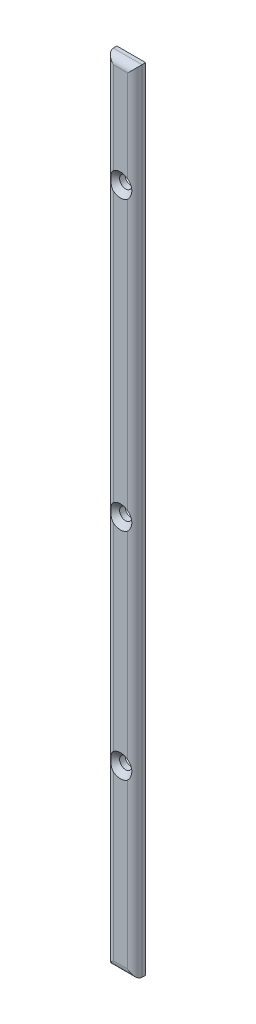
ISO-10303-21;
HEADER;
FILE_DESCRIPTION(('STEP AP214'),'2;1');
FILE_NAME('part.step','',(''),(''),'','','');
FILE_SCHEMA(('AUTOMOTIVE_DESIGN { 1 0 10303 214 1 1 1 1 }'));
ENDSEC;
DATA;
#1=APPLICATION_CONTEXT('core data for automotive mechanical design processes');
#2=APPLICATION_PROTOCOL_DEFINITION('international standard','automotive_design',2000,#1);
#3=PRODUCT_CONTEXT('',#1,'mechanical');
#4=PRODUCT('Part','Part','',(#3));
#5=PRODUCT_RELATED_PRODUCT_CATEGORY('part','',(#4));
#6=PRODUCT_DEFINITION_FORMATION('','',#4);
#7=PRODUCT_DEFINITION_CONTEXT('part definition',#1,'design');
#8=PRODUCT_DEFINITION('design','',#6,#7);
#9=PRODUCT_DEFINITION_SHAPE('','',#8);
#10=(LENGTH_UNIT() NAMED_UNIT(*) SI_UNIT(.MILLI.,.METRE.));
#11=(NAMED_UNIT(*) PLANE_ANGLE_UNIT() SI_UNIT($,.RADIAN.));
#12=(NAMED_UNIT(*) SI_UNIT($,.STERADIAN.) SOLID_ANGLE_UNIT());
#13=UNCERTAINTY_MEASURE_WITH_UNIT(LENGTH_MEASURE(1.E-05),#10,'distance_accuracy_value','');
#14=(GEOMETRIC_REPRESENTATION_CONTEXT(3) GLOBAL_UNCERTAINTY_ASSIGNED_CONTEXT((#13)) GLOBAL_UNIT_ASSIGNED_CONTEXT((#10,
#11,#12)) REPRESENTATION_CONTEXT('',''));
#15=CARTESIAN_POINT('',(0.,0.,0.));
#16=DIRECTION('',(0.,0.,1.));
#17=DIRECTION('',(1.,0.,0.));
#18=AXIS2_PLACEMENT_3D('',#15,#16,#17);
#19=CARTESIAN_POINT('',(0.,0.,3.));
#20=DIRECTION('',(0.,0.,1.));
#21=DIRECTION('',(1.,0.,0.));
#22=AXIS2_PLACEMENT_3D('',#19,#20,#21);
#23=PLANE('',#22);
#24=CARTESIAN_POINT('',(0.,80.,3.));
#25=DIRECTION('',(0.,0.,1.));
#26=DIRECTION('',(1.,0.,0.));
#27=AXIS2_PLACEMENT_3D('',#24,#25,#26);
#28=CIRCLE('',#27,3.15);
#29=CARTESIAN_POINT('',(-2.,77.5663812952724,3.));
#30=VERTEX_POINT('',#29);
#31=CARTESIAN_POINT('',(2.,77.5663812952724,3.));
#32=VERTEX_POINT('',#31);
#33=EDGE_CURVE('E164',#30,#32,#28,.T.);
#34=ORIENTED_EDGE('',*,*,#33,.F.);
#35=DIRECTION('',(0.,-1.,0.));
#36=VECTOR('',#35,1.);
#37=CARTESIAN_POINT('',(-2.,-110.,3.));
#38=LINE('',#37,#36);
#39=CARTESIAN_POINT('',(-2.,2.4336187047276,3.));
#40=VERTEX_POINT('',#39);
#41=EDGE_CURVE('E189',#30,#40,#38,.T.);
#42=ORIENTED_EDGE('',*,*,#41,.T.);
#43=CARTESIAN_POINT('',(0.,0.,3.));
#44=DIRECTION('',(0.,0.,1.));
#45=DIRECTION('',(1.,0.,0.));
#46=AXIS2_PLACEMENT_3D('',#43,#44,#45);
#47=CIRCLE('',#46,3.15);
#48=CARTESIAN_POINT('',(2.,2.4336187047276,3.));
#49=VERTEX_POINT('',#48);
#50=EDGE_CURVE('E336',#49,#40,#47,.T.);
#51=ORIENTED_EDGE('',*,*,#50,.F.);
#52=DIRECTION('',(0.,1.,0.));
#53=VECTOR('',#52,1.);
#54=CARTESIAN_POINT('',(2.,110.,3.));
#55=LINE('',#54,#53);
#56=EDGE_CURVE('E176',#49,#32,#55,.T.);
#57=ORIENTED_EDGE('',*,*,#56,.T.);
#58=EDGE_LOOP('',(#34,#42,#51,#57));
#59=FACE_BOUND('',#58,.T.);
#60=ADVANCED_FACE('F33',(#59),#23,.T.);
#61=CARTESIAN_POINT('',(-2.,-2.43361870472758,3.));
#62=VERTEX_POINT('',#61);
#63=CARTESIAN_POINT('',(2.,-2.43361870472759,3.));
#64=VERTEX_POINT('',#63);
#65=EDGE_CURVE('E169',#62,#64,#47,.T.);
#66=ORIENTED_EDGE('',*,*,#65,.F.);
#67=DIRECTION('',(0.,-1.,0.));
#68=VECTOR('',#67,1.);
#69=CARTESIAN_POINT('',(-2.,-110.,3.));
#70=LINE('',#69,#68);
#71=CARTESIAN_POINT('',(-2.,-57.5663812952724,3.));
#72=VERTEX_POINT('',#71);
#73=EDGE_CURVE('E187',#62,#72,#70,.T.);
#74=ORIENTED_EDGE('',*,*,#73,.T.);
#75=CARTESIAN_POINT('',(0.,-60.,3.));
#76=DIRECTION('',(0.,0.,1.));
#77=DIRECTION('',(1.,0.,0.));
#78=AXIS2_PLACEMENT_3D('',#75,#76,#77);
#79=CIRCLE('',#78,3.15);
#80=CARTESIAN_POINT('',(2.,-57.5663812952724,3.));
#81=VERTEX_POINT('',#80);
#82=EDGE_CURVE('E327',#81,#72,#79,.T.);
#83=ORIENTED_EDGE('',*,*,#82,.F.);
#84=DIRECTION('',(0.,1.,0.));
#85=VECTOR('',#84,1.);
#86=CARTESIAN_POINT('',(2.,110.,3.));
#87=LINE('',#86,#85);
#88=EDGE_CURVE('E178',#81,#64,#87,.T.);
#89=ORIENTED_EDGE('',*,*,#88,.T.);
#90=EDGE_LOOP('',(#66,#74,#83,#89));
#91=FACE_BOUND('',#90,.T.);
#92=ADVANCED_FACE('F250',(#91),#23,.T.);
#93=CARTESIAN_POINT('',(-2.,-62.4336187047276,3.));
#94=VERTEX_POINT('',#93);
#95=CARTESIAN_POINT('',(2.,-62.4336187047276,3.));
#96=VERTEX_POINT('',#95);
#97=EDGE_CURVE('E324',#94,#96,#79,.T.);
#98=ORIENTED_EDGE('',*,*,#97,.F.);
#99=DIRECTION('',(0.,-1.,0.));
#100=VECTOR('',#99,1.);
#101=CARTESIAN_POINT('',(-2.,-110.,3.));
#102=LINE('',#101,#100);
#103=CARTESIAN_POINT('',(-2.,-108.,3.));
#104=VERTEX_POINT('',#103);
#105=EDGE_CURVE('E185',#94,#104,#102,.T.);
#106=ORIENTED_EDGE('',*,*,#105,.T.);
#107=DIRECTION('',(1.,0.,0.));
#108=VECTOR('',#107,1.);
#109=CARTESIAN_POINT('',(4.,-108.,3.));
#110=LINE('',#109,#108);
#111=CARTESIAN_POINT('',(2.,-108.,3.));
#112=VERTEX_POINT('',#111);
#113=EDGE_CURVE('E182',#104,#112,#110,.T.);
#114=ORIENTED_EDGE('',*,*,#113,.T.);
#115=DIRECTION('',(0.,1.,0.));
#116=VECTOR('',#115,1.);
#117=CARTESIAN_POINT('',(2.,110.,3.));
#118=LINE('',#117,#116);
#119=EDGE_CURVE('E180',#112,#96,#118,.T.);
#120=ORIENTED_EDGE('',*,*,#119,.T.);
#121=EDGE_LOOP('',(#98,#106,#114,#120));
#122=FACE_BOUND('',#121,.T.);
#123=ADVANCED_FACE('F227',(#122),#23,.T.);
#124=DIRECTION('',(-1.,0.,0.));
#125=VECTOR('',#124,1.);
#126=CARTESIAN_POINT('',(-4.,108.,3.));
#127=LINE('',#126,#125);
#128=CARTESIAN_POINT('',(2.,108.,3.));
#129=VERTEX_POINT('',#128);
#130=CARTESIAN_POINT('',(-2.,108.,3.));
#131=VERTEX_POINT('',#130);
#132=EDGE_CURVE('E172',#129,#131,#127,.T.);
#133=ORIENTED_EDGE('',*,*,#132,.T.);
#134=DIRECTION('',(0.,-1.,0.));
#135=VECTOR('',#134,1.);
#136=CARTESIAN_POINT('',(-2.,-110.,3.));
#137=LINE('',#136,#135);
#138=CARTESIAN_POINT('',(-2.,82.4336187047276,3.));
#139=VERTEX_POINT('',#138);
#140=EDGE_CURVE('E174',#131,#139,#137,.T.);
#141=ORIENTED_EDGE('',*,*,#140,.T.);
#142=CARTESIAN_POINT('',(2.,82.4336187047276,3.));
#143=VERTEX_POINT('',#142);
#144=EDGE_CURVE('E264',#143,#139,#28,.T.);
#145=ORIENTED_EDGE('',*,*,#144,.F.);
#146=DIRECTION('',(0.,1.,0.));
#147=VECTOR('',#146,1.);
#148=CARTESIAN_POINT('',(2.,110.,3.));
#149=LINE('',#148,#147);
#150=EDGE_CURVE('E132',#143,#129,#149,.T.);
#151=ORIENTED_EDGE('',*,*,#150,.T.);
#152=EDGE_LOOP('',(#133,#141,#145,#151));
#153=FACE_BOUND('',#152,.T.);
#154=ADVANCED_FACE('F224',(#153),#23,.T.);
#155=CARTESIAN_POINT('',(0.,0.,0.));
#156=DIRECTION('',(0.,0.,1.));
#157=DIRECTION('',(1.,0.,0.));
#158=AXIS2_PLACEMENT_3D('',#155,#156,#157);
#159=PLANE('',#158);
#160=CARTESIAN_POINT('',(0.,-60.,0.));
#161=DIRECTION('',(0.,0.,1.));
#162=DIRECTION('',(1.,0.,0.));
#163=AXIS2_PLACEMENT_3D('',#160,#161,#162);
#164=CIRCLE('',#163,1.69999999999999);
#165=CARTESIAN_POINT('',(1.7,-60.,0.));
#166=VERTEX_POINT('',#165);
#167=EDGE_CURVE('E166',#166,#166,#164,.T.);
#168=ORIENTED_EDGE('',*,*,#167,.T.);
#169=EDGE_LOOP('',(#168));
#170=FACE_BOUND('',#169,.T.);
#171=CARTESIAN_POINT('',(0.,0.,0.));
#172=DIRECTION('',(0.,0.,1.));
#173=DIRECTION('',(1.,0.,0.));
#174=AXIS2_PLACEMENT_3D('',#171,#172,#173);
#175=CIRCLE('',#174,1.69999999999999);
#176=CARTESIAN_POINT('',(1.7,0.,0.));
#177=VERTEX_POINT('',#176);
#178=EDGE_CURVE('E161',#177,#177,#175,.T.);
#179=ORIENTED_EDGE('',*,*,#178,.T.);
#180=EDGE_LOOP('',(#179));
#181=FACE_BOUND('',#180,.T.);
#182=CARTESIAN_POINT('',(0.,80.,0.));
#183=DIRECTION('',(0.,0.,1.));
#184=DIRECTION('',(1.,0.,0.));
#185=AXIS2_PLACEMENT_3D('',#182,#183,#184);
#186=CIRCLE('',#185,1.69999999999999);
#187=CARTESIAN_POINT('',(1.69999999999999,80.,0.));
#188=VERTEX_POINT('',#187);
#189=EDGE_CURVE('E146',#188,#188,#186,.T.);
#190=ORIENTED_EDGE('',*,*,#189,.T.);
#191=EDGE_LOOP('',(#190));
#192=FACE_BOUND('',#191,.T.);
#193=DIRECTION('',(0.,-1.,0.));
#194=VECTOR('',#193,1.);
#195=CARTESIAN_POINT('',(-4.,-110.,0.));
#196=LINE('',#195,#194);
#197=CARTESIAN_POINT('',(-4.,110.,0.));
#198=VERTEX_POINT('',#197);
#199=CARTESIAN_POINT('',(-4.,-110.,0.));
#200=VERTEX_POINT('',#199);
#201=EDGE_CURVE('E139',#198,#200,#196,.T.);
#202=ORIENTED_EDGE('',*,*,#201,.F.);
#203=DIRECTION('',(-1.,0.,0.));
#204=VECTOR('',#203,1.);
#205=CARTESIAN_POINT('',(4.,110.,0.));
#206=LINE('',#205,#204);
#207=CARTESIAN_POINT('',(4.,110.,0.));
#208=VERTEX_POINT('',#207);
#209=EDGE_CURVE('E155',#208,#198,#206,.T.);
#210=ORIENTED_EDGE('',*,*,#209,.F.);
#211=DIRECTION('',(0.,1.,0.));
#212=VECTOR('',#211,1.);
#213=CARTESIAN_POINT('',(4.,-110.,0.));
#214=LINE('',#213,#212);
#215=CARTESIAN_POINT('',(4.,-110.,0.));
#216=VERTEX_POINT('',#215);
#217=EDGE_CURVE('E141',#216,#208,#214,.T.);
#218=ORIENTED_EDGE('',*,*,#217,.F.);
#219=DIRECTION('',(1.,0.,0.));
#220=VECTOR('',#219,1.);
#221=CARTESIAN_POINT('',(4.,-110.,0.));
#222=LINE('',#221,#220);
#223=EDGE_CURVE('E127',#200,#216,#222,.T.);
#224=ORIENTED_EDGE('',*,*,#223,.F.);
#225=EDGE_LOOP('',(#202,#210,#218,#224));
#226=FACE_BOUND('',#225,.T.);
#227=ADVANCED_FACE('F137',(#170,#181,#192,#226),#159,.F.);
#228=CARTESIAN_POINT('',(-4.,-110.,3.));
#229=DIRECTION('',(1.,0.,0.));
#230=DIRECTION('',(0.,0.,-1.));
#231=AXIS2_PLACEMENT_3D('',#228,#229,#230);
#232=PLANE('',#231);
#233=DIRECTION('',(0.,0.,-1.));
#234=VECTOR('',#233,1.);
#235=CARTESIAN_POINT('',(-4.,-110.,3.));
#236=LINE('',#235,#234);
#237=CARTESIAN_POINT('',(-4.,-110.,1.));
#238=VERTEX_POINT('',#237);
#239=EDGE_CURVE('E123',#238,#200,#236,.T.);
#240=ORIENTED_EDGE('',*,*,#239,.F.);
#241=DIRECTION('',(0.,-1.,0.));
#242=VECTOR('',#241,1.);
#243=CARTESIAN_POINT('',(-4.,110.,1.));
#244=LINE('',#243,#242);
#245=CARTESIAN_POINT('',(-4.,110.,1.));
#246=VERTEX_POINT('',#245);
#247=EDGE_CURVE('E42',#238,#246,#244,.F.);
#248=ORIENTED_EDGE('',*,*,#247,.T.);
#249=DIRECTION('',(0.,0.,-1.));
#250=VECTOR('',#249,1.);
#251=CARTESIAN_POINT('',(-4.,110.,3.));
#252=LINE('',#251,#250);
#253=EDGE_CURVE('E144',#246,#198,#252,.T.);
#254=ORIENTED_EDGE('',*,*,#253,.T.);
#255=ORIENTED_EDGE('',*,*,#201,.T.);
#256=EDGE_LOOP('',(#240,#248,#254,#255));
#257=FACE_BOUND('',#256,.T.);
#258=ADVANCED_FACE('F143',(#257),#232,.F.);
#259=CARTESIAN_POINT('',(4.,-110.,3.));
#260=DIRECTION('',(0.,1.,0.));
#261=DIRECTION('',(0.,0.,1.));
#262=AXIS2_PLACEMENT_3D('',#259,#260,#261);
#263=PLANE('',#262);
#264=DIRECTION('',(0.,0.,-1.));
#265=VECTOR('',#264,1.);
#266=CARTESIAN_POINT('',(4.,-110.,3.));
#267=LINE('',#266,#265);
#268=CARTESIAN_POINT('',(4.,-110.,1.));
#269=VERTEX_POINT('',#268);
#270=EDGE_CURVE('E133',#269,#216,#267,.T.);
#271=ORIENTED_EDGE('',*,*,#270,.F.);
#272=DIRECTION('',(1.,0.,0.));
#273=VECTOR('',#272,1.);
#274=CARTESIAN_POINT('',(-4.,-110.,1.));
#275=LINE('',#274,#273);
#276=EDGE_CURVE('E130',#269,#238,#275,.F.);
#277=ORIENTED_EDGE('',*,*,#276,.T.);
#278=ORIENTED_EDGE('',*,*,#239,.T.);
#279=ORIENTED_EDGE('',*,*,#223,.T.);
#280=EDGE_LOOP('',(#271,#277,#278,#279));
#281=FACE_BOUND('',#280,.T.);
#282=ADVANCED_FACE('F126',(#281),#263,.F.);
#283=CARTESIAN_POINT('',(4.,-110.,3.));
#284=DIRECTION('',(-1.,0.,0.));
#285=DIRECTION('',(0.,0.,1.));
#286=AXIS2_PLACEMENT_3D('',#283,#284,#285);
#287=PLANE('',#286);
#288=DIRECTION('',(0.,0.,-1.));
#289=VECTOR('',#288,1.);
#290=CARTESIAN_POINT('',(4.,110.,3.));
#291=LINE('',#290,#289);
#292=CARTESIAN_POINT('',(4.,110.,1.));
#293=VERTEX_POINT('',#292);
#294=EDGE_CURVE('E158',#293,#208,#291,.T.);
#295=ORIENTED_EDGE('',*,*,#294,.F.);
#296=DIRECTION('',(0.,1.,0.));
#297=VECTOR('',#296,1.);
#298=CARTESIAN_POINT('',(4.,-110.,1.));
#299=LINE('',#298,#297);
#300=EDGE_CURVE('E11',#293,#269,#299,.F.);
#301=ORIENTED_EDGE('',*,*,#300,.T.);
#302=ORIENTED_EDGE('',*,*,#270,.T.);
#303=ORIENTED_EDGE('',*,*,#217,.T.);
#304=EDGE_LOOP('',(#295,#301,#302,#303));
#305=FACE_BOUND('',#304,.T.);
#306=ADVANCED_FACE('F234',(#305),#287,.F.);
#307=CARTESIAN_POINT('',(4.,110.,3.));
#308=DIRECTION('',(0.,-1.,0.));
#309=DIRECTION('',(1.,0.,0.));
#310=AXIS2_PLACEMENT_3D('',#307,#308,#309);
#311=PLANE('',#310);
#312=ORIENTED_EDGE('',*,*,#253,.F.);
#313=DIRECTION('',(-1.,0.,0.));
#314=VECTOR('',#313,1.);
#315=CARTESIAN_POINT('',(4.,110.,1.));
#316=LINE('',#315,#314);
#317=EDGE_CURVE('E50',#246,#293,#316,.F.);
#318=ORIENTED_EDGE('',*,*,#317,.T.);
#319=ORIENTED_EDGE('',*,*,#294,.T.);
#320=ORIENTED_EDGE('',*,*,#209,.T.);
#321=EDGE_LOOP('',(#312,#318,#319,#320));
#322=FACE_BOUND('',#321,.T.);
#323=ADVANCED_FACE('F222',(#322),#311,.F.);
#324=CARTESIAN_POINT('',(0.,80.,3.));
#325=DIRECTION('',(0.,0.,1.));
#326=DIRECTION('',(1.,0.,0.));
#327=AXIS2_PLACEMENT_3D('',#324,#325,#326);
#328=CYLINDRICAL_SURFACE('',#327,1.69999999999999);
#329=CARTESIAN_POINT('',(0.,80.,1.55));
#330=DIRECTION('',(0.,0.,1.));
#331=DIRECTION('',(1.,0.,0.));
#332=AXIS2_PLACEMENT_3D('',#329,#330,#331);
#333=CIRCLE('',#332,1.7);
#334=CARTESIAN_POINT('',(1.7,80.,1.55));
#335=VERTEX_POINT('',#334);
#336=EDGE_CURVE('E149',#335,#335,#333,.T.);
#337=ORIENTED_EDGE('',*,*,#336,.T.);
#338=EDGE_LOOP('',(#337));
#339=FACE_BOUND('',#338,.T.);
#340=ORIENTED_EDGE('',*,*,#189,.F.);
#341=EDGE_LOOP('',(#340));
#342=FACE_BOUND('',#341,.T.);
#343=ADVANCED_FACE('F216',(#339,#342),#328,.F.);
#344=CARTESIAN_POINT('',(0.,80.,3.));
#345=DIRECTION('',(0.,0.,1.));
#346=DIRECTION('',(1.,0.,0.));
#347=AXIS2_PLACEMENT_3D('',#344,#345,#346);
#348=CONICAL_SURFACE('',#347,3.15,0.785398163397448);
#349=ORIENTED_EDGE('',*,*,#336,.F.);
#350=EDGE_LOOP('',(#349));
#351=FACE_BOUND('',#350,.T.);
#352=ORIENTED_EDGE('',*,*,#144,.T.);
#353=CARTESIAN_POINT('',(-2.,82.4336187047276,3.));
#354=CARTESIAN_POINT('',(-2.0465112350952,82.3953731232777,2.99997622566603));
#355=CARTESIAN_POINT('',(-2.09082685371256,82.3546427067003,2.9983780847489));
#356=CARTESIAN_POINT('',(-2.17508102718188,82.2692756880661,2.99277373647325));
#357=CARTESIAN_POINT('',(-2.21503356211114,82.2246524387478,2.9887755040122));
#358=CARTESIAN_POINT('',(-2.29046104774482,82.1328096881214,2.97915538095495));
#359=CARTESIAN_POINT('',(-2.32598068775503,82.0856244140593,2.97355196299925));
#360=CARTESIAN_POINT('',(-2.39333325486401,81.9887720077188,2.96123995722115));
#361=CARTESIAN_POINT('',(-2.42516224629899,81.9391023053887,2.95453020774922));
#362=CARTESIAN_POINT('',(-2.49938177619542,81.8141523451733,2.93718272980988));
#363=CARTESIAN_POINT('',(-2.53977188673672,81.7377347462009,2.92617287437162));
#364=CARTESIAN_POINT('',(-2.61374847610359,81.5817401163028,2.90389119476118));
#365=CARTESIAN_POINT('',(-2.64733378642253,81.5021625455542,2.89261932596642));
#366=CARTESIAN_POINT('',(-2.70843781223886,81.3400974820485,2.87060846432553));
#367=CARTESIAN_POINT('',(-2.7359189249836,81.2575953963311,2.85987307391435));
#368=CARTESIAN_POINT('',(-2.78498718516828,81.0906973350137,2.83970049666769));
#369=CARTESIAN_POINT('',(-2.8065733482497,81.0063010456565,2.8302635267772));
#370=CARTESIAN_POINT('',(-2.845089181494,80.8318764118577,2.81281374141079));
#371=CARTESIAN_POINT('',(-2.86173528095393,80.7417761460306,2.80489460797801));
#372=CARTESIAN_POINT('',(-2.88911701821794,80.560500609626,2.79156423739698));
#373=CARTESIAN_POINT('',(-2.89985256377382,80.469325322293,2.78615303939123));
#374=CARTESIAN_POINT('',(-2.91554613702379,80.286522277315,2.77816001589182));
#375=CARTESIAN_POINT('',(-2.92051461279806,80.1948956408802,2.77557307425896));
#376=CARTESIAN_POINT('',(-2.92477421000019,80.0114753588071,2.77335763240155));
#377=CARTESIAN_POINT('',(-2.92406513612518,79.9196817075322,2.77372923394835));
#378=CARTESIAN_POINT('',(-2.91625368319037,79.7181222474765,2.77778156656123));
#379=CARTESIAN_POINT('',(-2.9079072727136,79.6084146251149,2.78210601776592));
#380=CARTESIAN_POINT('',(-2.88287959655842,79.3901452025949,2.79463584987756));
#381=CARTESIAN_POINT('',(-2.866195578705,79.2815837928826,2.80284251222241));
#382=CARTESIAN_POINT('',(-2.82411833475963,79.0662748454608,2.82246283787163));
#383=CARTESIAN_POINT('',(-2.79871246532792,78.9595301784254,2.83388115247406));
#384=CARTESIAN_POINT('',(-2.73865433011135,78.7490106620892,2.85888249330564));
#385=CARTESIAN_POINT('',(-2.70400773559043,78.6452340343366,2.87246418976096));
#386=CARTESIAN_POINT('',(-2.61785996589074,78.4243974147458,2.90281389620706));
#387=CARTESIAN_POINT('',(-2.56449973007721,78.3080572525871,2.91973243776215));
#388=CARTESIAN_POINT('',(-2.4728298934984,78.1401149503817,2.94355498870813));
#389=CARTESIAN_POINT('',(-2.44043491026309,78.0853636706483,2.95121858022983));
#390=CARTESIAN_POINT('',(-2.37144811397175,77.978441716733,2.96552061864115));
#391=CARTESIAN_POINT('',(-2.33485797450716,77.9262700252713,2.9721594718711));
#392=CARTESIAN_POINT('',(-2.25268357388062,77.8193479398578,2.98445719665093));
#393=CARTESIAN_POINT('',(-2.20654903198836,77.7649887432475,2.9899161632939));
#394=CARTESIAN_POINT('',(-2.13274096784029,77.6873385114266,2.99574362548479));
#395=CARTESIAN_POINT('',(-2.1072764850373,77.6620241899098,2.99729381111053));
#396=CARTESIAN_POINT('',(-2.0548005154109,77.6129641451259,2.99942122044573));
#397=CARTESIAN_POINT('',(-2.02778764841296,77.5892198632401,2.99999756171013));
#398=CARTESIAN_POINT('',(-2.00000000000001,77.5663812952724,3.));
#399=B_SPLINE_CURVE_WITH_KNOTS('',3,(#353,#354,#355,#356,#357,#358,#359,#360,#361,#362,#363,
#364,#365,#366,#367,#368,#369,#370,#371,#372,#373,#374,#375,#376,#377,#378,#379,#380,#381,#382,
#383,#384,#385,#386,#387,#388,#389,#390,#391,#392,#393,#394,#395,#396,#397,#398),.UNSPECIFIED.,
.F.,.F.,(4,2,2,2,2,2,2,2,2,2,2,2,2,2,2,2,2,2,2,2,2,2,4),(0.,0.180369444855053,0.360142859575538,
0.537925260528485,0.715895536077925,0.97689538910426,1.23794002258727,1.50055068631535,
1.76320517487832,2.03886812780881,2.31453538299135,2.58970243418258,2.86487895092581,
3.19480855737534,3.52484714285847,3.8553661921785,4.18568285861033,4.57183446726369,
4.76390717382735,4.95590352089191,5.16993409398904,5.27768122712503,5.38552594262623),.UNSPECIFIED.);
#400=EDGE_CURVE('E201',#139,#30,#399,.T.);
#401=ORIENTED_EDGE('',*,*,#400,.T.);
#402=ORIENTED_EDGE('',*,*,#33,.T.);
#403=CARTESIAN_POINT('',(2.,77.5663812952724,3.));
#404=CARTESIAN_POINT('',(2.04651123509519,77.6046268767223,2.99997622566602));
#405=CARTESIAN_POINT('',(2.09082685371255,77.6453572932997,2.9983780847489));
#406=CARTESIAN_POINT('',(2.17508102718187,77.7307243119339,2.99277373647325));
#407=CARTESIAN_POINT('',(2.21503356211113,77.7753475612522,2.98877550401221));
#408=CARTESIAN_POINT('',(2.29046104774481,77.8671903118786,2.97915538095495));
#409=CARTESIAN_POINT('',(2.32598068775502,77.9143755859407,2.97355196299925));
#410=CARTESIAN_POINT('',(2.39333325486401,78.0112279922812,2.96123995722115));
#411=CARTESIAN_POINT('',(2.42516224629898,78.0608976946113,2.95453020774923));
#412=CARTESIAN_POINT('',(2.49938177619541,78.1858476548267,2.93718272980989));
#413=CARTESIAN_POINT('',(2.53977188673671,78.262265253799,2.92617287437162));
#414=CARTESIAN_POINT('',(2.61374847610358,78.4182598836972,2.90389119476119));
#415=CARTESIAN_POINT('',(2.64733378642252,78.4978374544457,2.89261932596643));
#416=CARTESIAN_POINT('',(2.70843781223885,78.6599025179515,2.87060846432553));
#417=CARTESIAN_POINT('',(2.73591892498359,78.7424046036689,2.85987307391436));
#418=CARTESIAN_POINT('',(2.78498718516827,78.9093026649863,2.83970049666769));
#419=CARTESIAN_POINT('',(2.8065733482497,78.9936989543435,2.8302635267772));
#420=CARTESIAN_POINT('',(2.845089181494,79.1681235881423,2.81281374141079));
#421=CARTESIAN_POINT('',(2.86173528095393,79.2582238539694,2.80489460797801));
#422=CARTESIAN_POINT('',(2.88911701821794,79.439499390374,2.79156423739698));
#423=CARTESIAN_POINT('',(2.89985256377382,79.530674677707,2.78615303939123));
#424=CARTESIAN_POINT('',(2.91554613702379,79.713477722685,2.77816001589182));
#425=CARTESIAN_POINT('',(2.92051461279807,79.8051043591198,2.77557307425896));
#426=CARTESIAN_POINT('',(2.92477421000019,79.9885246411929,2.77335763240155));
#427=CARTESIAN_POINT('',(2.92406513612518,80.0803182924678,2.77372923394835));
#428=CARTESIAN_POINT('',(2.91625368319037,80.2818777525235,2.77778156656123));
#429=CARTESIAN_POINT('',(2.9079072727136,80.3915853748851,2.78210601776592));
#430=CARTESIAN_POINT('',(2.88287959655843,80.6098547974051,2.79463584987756));
#431=CARTESIAN_POINT('',(2.86619557870501,80.7184162071174,2.80284251222241));
#432=CARTESIAN_POINT('',(2.82411833475964,80.9337251545392,2.82246283787162));
#433=CARTESIAN_POINT('',(2.79871246532793,81.0404698215746,2.83388115247406));
#434=CARTESIAN_POINT('',(2.73865433011136,81.2509893379108,2.85888249330564));
#435=CARTESIAN_POINT('',(2.70400773559044,81.3547659656634,2.87246418976095));
#436=CARTESIAN_POINT('',(2.61785996589075,81.5756025852542,2.90281389620706));
#437=CARTESIAN_POINT('',(2.56449973007722,81.6919427474128,2.91973243776215));
#438=CARTESIAN_POINT('',(2.47282989349841,81.8598850496183,2.94355498870813));
#439=CARTESIAN_POINT('',(2.44043491026311,81.9146363293516,2.95121858022983));
#440=CARTESIAN_POINT('',(2.37144811397176,82.021558283267,2.96552061864115));
#441=CARTESIAN_POINT('',(2.33485797450718,82.0737299747287,2.9721594718711));
#442=CARTESIAN_POINT('',(2.25268357388063,82.1806520601422,2.98445719665093));
#443=CARTESIAN_POINT('',(2.20654903198837,82.2350112567525,2.9899161632939));
#444=CARTESIAN_POINT('',(2.13274096784029,82.3126614885734,2.99574362548479));
#445=CARTESIAN_POINT('',(2.10727648503731,82.3379758100902,2.99729381111053));
#446=CARTESIAN_POINT('',(2.05480051541091,82.3870358548741,2.99942122044573));
#447=CARTESIAN_POINT('',(2.02778764841297,82.4107801367599,2.99999756171013));
#448=CARTESIAN_POINT('',(2.00000000000001,82.4336187047276,3.));
#449=B_SPLINE_CURVE_WITH_KNOTS('',3,(#403,#404,#405,#406,#407,#408,#409,#410,#411,#412,#413,
#414,#415,#416,#417,#418,#419,#420,#421,#422,#423,#424,#425,#426,#427,#428,#429,#430,#431,#432,
#433,#434,#435,#436,#437,#438,#439,#440,#441,#442,#443,#444,#445,#446,#447,#448),.UNSPECIFIED.,
.F.,.F.,(4,2,2,2,2,2,2,2,2,2,2,2,2,2,2,2,2,2,2,2,2,2,4),(0.,0.180369444855034,0.36014285957552,
0.537925260528482,0.715895536077908,0.976895389104229,1.23794002258724,1.50055068631532,
1.76320517487831,2.03886812780881,2.31453538299135,2.58970243418258,2.86487895092579,
3.19480855737531,3.52484714285844,3.85536619217847,4.1856828586103,4.57183446726367,
4.76390717382732,4.9559035208919,5.16993409398903,5.27768122712501,5.38552594262623),.UNSPECIFIED.);
#450=EDGE_CURVE('E193',#32,#143,#449,.T.);
#451=ORIENTED_EDGE('',*,*,#450,.T.);
#452=EDGE_LOOP('',(#352,#401,#402,#451));
#453=FACE_BOUND('',#452,.T.);
#454=ADVANCED_FACE('F210',(#351,#453),#348,.F.);
#455=CARTESIAN_POINT('',(0.,0.,3.));
#456=DIRECTION('',(0.,0.,1.));
#457=DIRECTION('',(1.,0.,0.));
#458=AXIS2_PLACEMENT_3D('',#455,#456,#457);
#459=CYLINDRICAL_SURFACE('',#458,1.69999999999999);
#460=CARTESIAN_POINT('',(0.,0.,1.55));
#461=DIRECTION('',(0.,0.,1.));
#462=DIRECTION('',(1.,0.,0.));
#463=AXIS2_PLACEMENT_3D('',#460,#461,#462);
#464=CIRCLE('',#463,1.7);
#465=CARTESIAN_POINT('',(1.7,0.,1.55));
#466=VERTEX_POINT('',#465);
#467=EDGE_CURVE('E165',#466,#466,#464,.T.);
#468=ORIENTED_EDGE('',*,*,#467,.T.);
#469=EDGE_LOOP('',(#468));
#470=FACE_BOUND('',#469,.T.);
#471=ORIENTED_EDGE('',*,*,#178,.F.);
#472=EDGE_LOOP('',(#471));
#473=FACE_BOUND('',#472,.T.);
#474=ADVANCED_FACE('F215',(#470,#473),#459,.F.);
#475=CARTESIAN_POINT('',(0.,0.,3.));
#476=DIRECTION('',(0.,0.,1.));
#477=DIRECTION('',(1.,0.,0.));
#478=AXIS2_PLACEMENT_3D('',#475,#476,#477);
#479=CONICAL_SURFACE('',#478,3.15,0.785398163397448);
#480=ORIENTED_EDGE('',*,*,#467,.F.);
#481=EDGE_LOOP('',(#480));
#482=FACE_BOUND('',#481,.T.);
#483=ORIENTED_EDGE('',*,*,#50,.T.);
#484=CARTESIAN_POINT('',(-2.,2.4336187047276,3.));
#485=CARTESIAN_POINT('',(-2.0465112350952,2.39537312327771,2.99997622566602));
#486=CARTESIAN_POINT('',(-2.09082685371256,2.35464270670035,2.9983780847489));
#487=CARTESIAN_POINT('',(-2.17508102718188,2.26927568806611,2.99277373647325));
#488=CARTESIAN_POINT('',(-2.21503356211113,2.22465243874777,2.98877550401221));
#489=CARTESIAN_POINT('',(-2.29046104774482,2.13280968812143,2.97915538095495));
#490=CARTESIAN_POINT('',(-2.32598068775503,2.08562441405933,2.97355196299925));
#491=CARTESIAN_POINT('',(-2.39333325486401,1.98877200771881,2.96123995722115));
#492=CARTESIAN_POINT('',(-2.42516224629899,1.93910230538869,2.95453020774922));
#493=CARTESIAN_POINT('',(-2.49938177619541,1.81415234517331,2.93718272980989));
#494=CARTESIAN_POINT('',(-2.53977188673671,1.73773474620095,2.92617287437162));
#495=CARTESIAN_POINT('',(-2.61374847610358,1.58174011630284,2.90389119476119));
#496=CARTESIAN_POINT('',(-2.64733378642252,1.50216254555425,2.89261932596642));
#497=CARTESIAN_POINT('',(-2.70843781223885,1.34009748204855,2.87060846432553));
#498=CARTESIAN_POINT('',(-2.7359189249836,1.25759539633108,2.85987307391436));
#499=CARTESIAN_POINT('',(-2.78498718516827,1.09069733501373,2.83970049666769));
#500=CARTESIAN_POINT('',(-2.8065733482497,1.00630104565647,2.8302635267772));
#501=CARTESIAN_POINT('',(-2.845089181494,0.831876411857728,2.81281374141079));
#502=CARTESIAN_POINT('',(-2.86173528095393,0.741776146030568,2.804894607978));
#503=CARTESIAN_POINT('',(-2.88911701821794,0.560500609626011,2.79156423739698));
#504=CARTESIAN_POINT('',(-2.89985256377382,0.469325322293037,2.78615303939123));
#505=CARTESIAN_POINT('',(-2.91554613702379,0.286522277315047,2.77816001589182));
#506=CARTESIAN_POINT('',(-2.92051461279806,0.194895640880221,2.77557307425896));
#507=CARTESIAN_POINT('',(-2.92477421000018,0.01147535880708,2.77335763240155));
#508=CARTESIAN_POINT('',(-2.92406513612517,-0.0803182924678108,2.77372923394835));
#509=CARTESIAN_POINT('',(-2.91625368319037,-0.281877752523528,2.77778156656123));
#510=CARTESIAN_POINT('',(-2.9079072727136,-0.391585374885089,2.78210601776592));
#511=CARTESIAN_POINT('',(-2.88287959655842,-0.60985479740507,2.79463584987756));
#512=CARTESIAN_POINT('',(-2.866195578705,-0.718416207117396,2.80284251222241));
#513=CARTESIAN_POINT('',(-2.82411833475963,-0.933725154539163,2.82246283787162));
#514=CARTESIAN_POINT('',(-2.79871246532792,-1.04046982157461,2.83388115247406));
#515=CARTESIAN_POINT('',(-2.73865433011135,-1.25098933791082,2.85888249330564));
#516=CARTESIAN_POINT('',(-2.70400773559043,-1.35476596566338,2.87246418976096));
#517=CARTESIAN_POINT('',(-2.61785996589074,-1.57560258525419,2.90281389620706));
#518=CARTESIAN_POINT('',(-2.56449973007722,-1.69194274741284,2.91973243776215));
#519=CARTESIAN_POINT('',(-2.4728298934984,-1.85988504961828,2.94355498870813));
#520=CARTESIAN_POINT('',(-2.4404349102631,-1.91463632935165,2.95121858022983));
#521=CARTESIAN_POINT('',(-2.37144811397175,-2.02155828326704,2.96552061864115));
#522=CARTESIAN_POINT('',(-2.33485797450716,-2.07372997472871,2.9721594718711));
#523=CARTESIAN_POINT('',(-2.25268357388061,-2.18065206014222,2.98445719665093));
#524=CARTESIAN_POINT('',(-2.20654903198835,-2.23501125675247,2.9899161632939));
#525=CARTESIAN_POINT('',(-2.13274096784028,-2.31266148857342,2.99574362548479));
#526=CARTESIAN_POINT('',(-2.10727648503729,-2.33797581009019,2.99729381111054));
#527=CARTESIAN_POINT('',(-2.0548005154109,-2.38703585487414,2.99942122044573));
#528=CARTESIAN_POINT('',(-2.02778764841296,-2.41078013675987,2.99999756171013));
#529=CARTESIAN_POINT('',(-2.,-2.43361870472758,3.));
#530=B_SPLINE_CURVE_WITH_KNOTS('',3,(#484,#485,#486,#487,#488,#489,#490,#491,#492,#493,#494,
#495,#496,#497,#498,#499,#500,#501,#502,#503,#504,#505,#506,#507,#508,#509,#510,#511,#512,#513,
#514,#515,#516,#517,#518,#519,#520,#521,#522,#523,#524,#525,#526,#527,#528,#529),.UNSPECIFIED.,
.F.,.F.,(4,2,2,2,2,2,2,2,2,2,2,2,2,2,2,2,2,2,2,2,2,2,4),(0.,0.180369444855043,0.360142859575529,
0.537925260528482,0.71589553607791,0.976895389104238,1.23794002258725,1.50055068631534,
1.76320517487832,2.03886812780883,2.31453538299135,2.58970243418257,2.86487895092581,
3.19480855737532,3.52484714285844,3.85536619217848,4.18568285861031,4.57183446726367,
4.76390717382734,4.95590352089192,5.16993409398904,5.27768122712503,5.38552594262623),.UNSPECIFIED.);
#531=EDGE_CURVE('E271',#40,#62,#530,.T.);
#532=ORIENTED_EDGE('',*,*,#531,.T.);
#533=ORIENTED_EDGE('',*,*,#65,.T.);
#534=CARTESIAN_POINT('',(2.,-2.43361870472759,3.));
#535=CARTESIAN_POINT('',(2.0465112350952,-2.3953731232777,2.99997622566602));
#536=CARTESIAN_POINT('',(2.09082685371256,-2.35464270670034,2.9983780847489));
#537=CARTESIAN_POINT('',(2.17508102718188,-2.26927568806609,2.99277373647325));
#538=CARTESIAN_POINT('',(2.21503356211113,-2.22465243874776,2.98877550401221));
#539=CARTESIAN_POINT('',(2.29046104774482,-2.13280968812142,2.97915538095495));
#540=CARTESIAN_POINT('',(2.32598068775503,-2.08562441405932,2.97355196299925));
#541=CARTESIAN_POINT('',(2.39333325486401,-1.9887720077188,2.96123995722115));
#542=CARTESIAN_POINT('',(2.42516224629899,-1.93910230538868,2.95453020774922));
#543=CARTESIAN_POINT('',(2.49938177619541,-1.8141523451733,2.93718272980989));
#544=CARTESIAN_POINT('',(2.53977188673672,-1.73773474620094,2.92617287437162));
#545=CARTESIAN_POINT('',(2.61374847610358,-1.58174011630283,2.90389119476119));
#546=CARTESIAN_POINT('',(2.64733378642252,-1.50216254555424,2.89261932596642));
#547=CARTESIAN_POINT('',(2.70843781223885,-1.34009748204854,2.87060846432553));
#548=CARTESIAN_POINT('',(2.7359189249836,-1.25759539633107,2.85987307391436));
#549=CARTESIAN_POINT('',(2.78498718516828,-1.09069733501371,2.83970049666769));
#550=CARTESIAN_POINT('',(2.8065733482497,-1.00630104565646,2.8302635267772));
#551=CARTESIAN_POINT('',(2.845089181494,-0.831876411857718,2.81281374141079));
#552=CARTESIAN_POINT('',(2.86173528095393,-0.741776146030558,2.804894607978));
#553=CARTESIAN_POINT('',(2.88911701821795,-0.560500609626001,2.79156423739698));
#554=CARTESIAN_POINT('',(2.89985256377382,-0.469325322293028,2.78615303939123));
#555=CARTESIAN_POINT('',(2.91554613702379,-0.286522277315038,2.77816001589182));
#556=CARTESIAN_POINT('',(2.92051461279807,-0.194895640880212,2.77557307425896));
#557=CARTESIAN_POINT('',(2.92477421000019,-0.0114753588070712,2.77335763240155));
#558=CARTESIAN_POINT('',(2.92406513612518,0.0803182924678195,2.77372923394835));
#559=CARTESIAN_POINT('',(2.91625368319037,0.281877752523536,2.77778156656123));
#560=CARTESIAN_POINT('',(2.9079072727136,0.391585374885097,2.78210601776592));
#561=CARTESIAN_POINT('',(2.88287959655843,0.609854797405078,2.79463584987756));
#562=CARTESIAN_POINT('',(2.86619557870501,0.718416207117404,2.80284251222241));
#563=CARTESIAN_POINT('',(2.82411833475964,0.933725154539172,2.82246283787162));
#564=CARTESIAN_POINT('',(2.79871246532793,1.04046982157462,2.83388115247406));
#565=CARTESIAN_POINT('',(2.73865433011136,1.25098933791083,2.85888249330564));
#566=CARTESIAN_POINT('',(2.70400773559044,1.35476596566339,2.87246418976095));
#567=CARTESIAN_POINT('',(2.61785996589075,1.5756025852542,2.90281389620706));
#568=CARTESIAN_POINT('',(2.56449973007722,1.69194274741285,2.91973243776215));
#569=CARTESIAN_POINT('',(2.47282989349841,1.85988504961829,2.94355498870813));
#570=CARTESIAN_POINT('',(2.4404349102631,1.91463632935166,2.95121858022983));
#571=CARTESIAN_POINT('',(2.37144811397175,2.02155828326705,2.96552061864115));
#572=CARTESIAN_POINT('',(2.33485797450717,2.07372997472872,2.9721594718711));
#573=CARTESIAN_POINT('',(2.25268357388062,2.18065206014223,2.98445719665093));
#574=CARTESIAN_POINT('',(2.20654903198835,2.23501125675248,2.9899161632939));
#575=CARTESIAN_POINT('',(2.13274096784028,2.31266148857343,2.99574362548479));
#576=CARTESIAN_POINT('',(2.1072764850373,2.3379758100902,2.99729381111054));
#577=CARTESIAN_POINT('',(2.0548005154109,2.38703585487416,2.99942122044573));
#578=CARTESIAN_POINT('',(2.02778764841296,2.41078013675989,2.99999756171013));
#579=CARTESIAN_POINT('',(2.,2.4336187047276,3.));
#580=B_SPLINE_CURVE_WITH_KNOTS('',3,(#534,#535,#536,#537,#538,#539,#540,#541,#542,#543,#544,
#545,#546,#547,#548,#549,#550,#551,#552,#553,#554,#555,#556,#557,#558,#559,#560,#561,#562,#563,
#564,#565,#566,#567,#568,#569,#570,#571,#572,#573,#574,#575,#576,#577,#578,#579),.UNSPECIFIED.,
.F.,.F.,(4,2,2,2,2,2,2,2,2,2,2,2,2,2,2,2,2,2,2,2,2,2,4),(0.,0.180369444855043,0.360142859575529,
0.537925260528481,0.715895536077909,0.976895389104237,1.23794002258725,1.50055068631533,
1.76320517487832,2.03886812780882,2.31453538299135,2.58970243418257,2.8648789509258,
3.19480855737531,3.52484714285844,3.85536619217848,4.1856828586103,4.57183446726367,
4.76390717382734,4.95590352089192,5.16993409398904,5.27768122712503,5.38552594262624),.UNSPECIFIED.);
#581=EDGE_CURVE('E277',#64,#49,#580,.T.);
#582=ORIENTED_EDGE('',*,*,#581,.T.);
#583=EDGE_LOOP('',(#483,#532,#533,#582));
#584=FACE_BOUND('',#583,.T.);
#585=ADVANCED_FACE('F296',(#482,#584),#479,.F.);
#586=CARTESIAN_POINT('',(0.,-60.,3.));
#587=DIRECTION('',(0.,0.,1.));
#588=DIRECTION('',(1.,0.,0.));
#589=AXIS2_PLACEMENT_3D('',#586,#587,#588);
#590=CYLINDRICAL_SURFACE('',#589,1.69999999999999);
#591=CARTESIAN_POINT('',(0.,-60.,1.55));
#592=DIRECTION('',(0.,0.,1.));
#593=DIRECTION('',(1.,0.,0.));
#594=AXIS2_PLACEMENT_3D('',#591,#592,#593);
#595=CIRCLE('',#594,1.7);
#596=CARTESIAN_POINT('',(1.7,-60.,1.55));
#597=VERTEX_POINT('',#596);
#598=EDGE_CURVE('E170',#597,#597,#595,.T.);
#599=ORIENTED_EDGE('',*,*,#598,.T.);
#600=EDGE_LOOP('',(#599));
#601=FACE_BOUND('',#600,.T.);
#602=ORIENTED_EDGE('',*,*,#167,.F.);
#603=EDGE_LOOP('',(#602));
#604=FACE_BOUND('',#603,.T.);
#605=ADVANCED_FACE('F300',(#601,#604),#590,.F.);
#606=CARTESIAN_POINT('',(0.,-60.,3.));
#607=DIRECTION('',(0.,0.,1.));
#608=DIRECTION('',(1.,0.,0.));
#609=AXIS2_PLACEMENT_3D('',#606,#607,#608);
#610=CONICAL_SURFACE('',#609,3.15,0.785398163397448);
#611=ORIENTED_EDGE('',*,*,#598,.F.);
#612=EDGE_LOOP('',(#611));
#613=FACE_BOUND('',#612,.T.);
#614=ORIENTED_EDGE('',*,*,#82,.T.);
#615=CARTESIAN_POINT('',(-2.,-57.5663812952724,3.));
#616=CARTESIAN_POINT('',(-2.04651123509519,-57.6046268767223,2.99997622566602));
#617=CARTESIAN_POINT('',(-2.09082685371256,-57.6453572932996,2.9983780847489));
#618=CARTESIAN_POINT('',(-2.17508102718188,-57.7307243119339,2.99277373647325));
#619=CARTESIAN_POINT('',(-2.21503356211113,-57.7753475612522,2.98877550401221));
#620=CARTESIAN_POINT('',(-2.29046104774482,-57.8671903118786,2.97915538095495));
#621=CARTESIAN_POINT('',(-2.32598068775502,-57.9143755859407,2.97355196299925));
#622=CARTESIAN_POINT('',(-2.39333325486401,-58.0112279922812,2.96123995722115));
#623=CARTESIAN_POINT('',(-2.42516224629899,-58.0608976946113,2.95453020774922));
#624=CARTESIAN_POINT('',(-2.49938177619541,-58.1858476548267,2.93718272980988));
#625=CARTESIAN_POINT('',(-2.53977188673671,-58.262265253799,2.92617287437162));
#626=CARTESIAN_POINT('',(-2.61374847610358,-58.4182598836972,2.90389119476119));
#627=CARTESIAN_POINT('',(-2.64733378642252,-58.4978374544457,2.89261932596642));
#628=CARTESIAN_POINT('',(-2.70843781223885,-58.6599025179514,2.87060846432553));
#629=CARTESIAN_POINT('',(-2.7359189249836,-58.7424046036689,2.85987307391436));
#630=CARTESIAN_POINT('',(-2.78498718516827,-58.9093026649863,2.83970049666769));
#631=CARTESIAN_POINT('',(-2.8065733482497,-58.9936989543435,2.8302635267772));
#632=CARTESIAN_POINT('',(-2.845089181494,-59.1681235881423,2.81281374141079));
#633=CARTESIAN_POINT('',(-2.86173528095393,-59.2582238539694,2.804894607978));
#634=CARTESIAN_POINT('',(-2.88911701821794,-59.439499390374,2.79156423739698));
#635=CARTESIAN_POINT('',(-2.89985256377382,-59.530674677707,2.78615303939123));
#636=CARTESIAN_POINT('',(-2.91554613702379,-59.7134777226849,2.77816001589182));
#637=CARTESIAN_POINT('',(-2.92051461279806,-59.8051043591198,2.77557307425896));
#638=CARTESIAN_POINT('',(-2.92477421000018,-59.9885246411929,2.77335763240155));
#639=CARTESIAN_POINT('',(-2.92406513612517,-60.0803182924678,2.77372923394835));
#640=CARTESIAN_POINT('',(-2.91625368319037,-60.2818777525235,2.77778156656123));
#641=CARTESIAN_POINT('',(-2.9079072727136,-60.3915853748851,2.78210601776592));
#642=CARTESIAN_POINT('',(-2.88287959655842,-60.6098547974051,2.79463584987756));
#643=CARTESIAN_POINT('',(-2.866195578705,-60.7184162071174,2.80284251222241));
#644=CARTESIAN_POINT('',(-2.82411833475963,-60.9337251545392,2.82246283787162));
#645=CARTESIAN_POINT('',(-2.79871246532792,-61.0404698215746,2.83388115247406));
#646=CARTESIAN_POINT('',(-2.73865433011135,-61.2509893379108,2.85888249330564));
#647=CARTESIAN_POINT('',(-2.70400773559043,-61.3547659656634,2.87246418976096));
#648=CARTESIAN_POINT('',(-2.61785996589074,-61.5756025852542,2.90281389620706));
#649=CARTESIAN_POINT('',(-2.56449973007722,-61.6919427474128,2.91973243776215));
#650=CARTESIAN_POINT('',(-2.4728298934984,-61.8598850496183,2.94355498870813));
#651=CARTESIAN_POINT('',(-2.4404349102631,-61.9146363293516,2.95121858022983));
#652=CARTESIAN_POINT('',(-2.37144811397175,-62.021558283267,2.96552061864115));
#653=CARTESIAN_POINT('',(-2.33485797450716,-62.0737299747287,2.9721594718711));
#654=CARTESIAN_POINT('',(-2.25268357388061,-62.1806520601422,2.98445719665093));
#655=CARTESIAN_POINT('',(-2.20654903198835,-62.2350112567525,2.9899161632939));
#656=CARTESIAN_POINT('',(-2.13274096784027,-62.3126614885734,2.9957436254848));
#657=CARTESIAN_POINT('',(-2.10727648503729,-62.3379758100902,2.99729381111054));
#658=CARTESIAN_POINT('',(-2.05480051541089,-62.3870358548741,2.99942122044573));
#659=CARTESIAN_POINT('',(-2.02778764841295,-62.4107801367599,2.99999756171013));
#660=CARTESIAN_POINT('',(-1.99999999999999,-62.4336187047276,3.));
#661=B_SPLINE_CURVE_WITH_KNOTS('',3,(#615,#616,#617,#618,#619,#620,#621,#622,#623,#624,#625,
#626,#627,#628,#629,#630,#631,#632,#633,#634,#635,#636,#637,#638,#639,#640,#641,#642,#643,#644,
#645,#646,#647,#648,#649,#650,#651,#652,#653,#654,#655,#656,#657,#658,#659,#660),.UNSPECIFIED.,
.F.,.F.,(4,2,2,2,2,2,2,2,2,2,2,2,2,2,2,2,2,2,2,2,2,2,4),(0.,0.180369444855044,0.360142859575528,
0.537925260528483,0.71589553607791,0.976895389104243,1.23794002258725,1.50055068631534,
1.76320517487833,2.03886812780882,2.31453538299136,2.58970243418258,2.86487895092581,
3.19480855737533,3.52484714285844,3.85536619217848,4.18568285861031,4.57183446726368,
4.76390717382734,4.95590352089192,5.16993409398906,5.27768122712504,5.38552594262625),.UNSPECIFIED.);
#662=EDGE_CURVE('E279',#72,#94,#661,.T.);
#663=ORIENTED_EDGE('',*,*,#662,.T.);
#664=ORIENTED_EDGE('',*,*,#97,.T.);
#665=CARTESIAN_POINT('',(2.,-62.4336187047276,3.));
#666=CARTESIAN_POINT('',(2.0465112350952,-62.3953731232777,2.99997622566602));
#667=CARTESIAN_POINT('',(2.09082685371256,-62.3546427067003,2.9983780847489));
#668=CARTESIAN_POINT('',(2.17508102718188,-62.2692756880661,2.99277373647325));
#669=CARTESIAN_POINT('',(2.21503356211113,-62.2246524387478,2.98877550401221));
#670=CARTESIAN_POINT('',(2.29046104774482,-62.1328096881214,2.97915538095495));
#671=CARTESIAN_POINT('',(2.32598068775502,-62.0856244140593,2.97355196299925));
#672=CARTESIAN_POINT('',(2.39333325486401,-61.9887720077188,2.96123995722115));
#673=CARTESIAN_POINT('',(2.42516224629899,-61.9391023053887,2.95453020774922));
#674=CARTESIAN_POINT('',(2.49938177619542,-61.8141523451733,2.93718272980989));
#675=CARTESIAN_POINT('',(2.53977188673672,-61.7377347462009,2.92617287437162));
#676=CARTESIAN_POINT('',(2.61374847610358,-61.5817401163028,2.90389119476119));
#677=CARTESIAN_POINT('',(2.64733378642252,-61.5021625455542,2.89261932596642));
#678=CARTESIAN_POINT('',(2.70843781223886,-61.3400974820485,2.87060846432553));
#679=CARTESIAN_POINT('',(2.7359189249836,-61.2575953963311,2.85987307391436));
#680=CARTESIAN_POINT('',(2.78498718516828,-61.0906973350137,2.83970049666769));
#681=CARTESIAN_POINT('',(2.8065733482497,-61.0063010456565,2.8302635267772));
#682=CARTESIAN_POINT('',(2.845089181494,-60.8318764118577,2.81281374141079));
#683=CARTESIAN_POINT('',(2.86173528095393,-60.7417761460306,2.804894607978));
#684=CARTESIAN_POINT('',(2.88911701821795,-60.560500609626,2.79156423739698));
#685=CARTESIAN_POINT('',(2.89985256377382,-60.469325322293,2.78615303939123));
#686=CARTESIAN_POINT('',(2.91554613702379,-60.286522277315,2.77816001589182));
#687=CARTESIAN_POINT('',(2.92051461279807,-60.1948956408802,2.77557307425896));
#688=CARTESIAN_POINT('',(2.92477421000019,-60.0114753588071,2.77335763240155));
#689=CARTESIAN_POINT('',(2.92406513612518,-59.9196817075322,2.77372923394835));
#690=CARTESIAN_POINT('',(2.91625368319037,-59.7181222474765,2.77778156656123));
#691=CARTESIAN_POINT('',(2.9079072727136,-59.6084146251149,2.78210601776592));
#692=CARTESIAN_POINT('',(2.88287959655843,-59.3901452025949,2.79463584987756));
#693=CARTESIAN_POINT('',(2.86619557870501,-59.2815837928826,2.80284251222241));
#694=CARTESIAN_POINT('',(2.82411833475964,-59.0662748454608,2.82246283787162));
#695=CARTESIAN_POINT('',(2.79871246532793,-58.9595301784254,2.83388115247406));
#696=CARTESIAN_POINT('',(2.73865433011136,-58.7490106620892,2.85888249330563));
#697=CARTESIAN_POINT('',(2.70400773559044,-58.6452340343366,2.87246418976095));
#698=CARTESIAN_POINT('',(2.61785996589075,-58.4243974147458,2.90281389620706));
#699=CARTESIAN_POINT('',(2.56449973007722,-58.3080572525871,2.91973243776214));
#700=CARTESIAN_POINT('',(2.47282989349841,-58.1401149503817,2.94355498870813));
#701=CARTESIAN_POINT('',(2.4404349102631,-58.0853636706483,2.95121858022983));
#702=CARTESIAN_POINT('',(2.37144811397176,-57.978441716733,2.96552061864115));
#703=CARTESIAN_POINT('',(2.33485797450717,-57.9262700252713,2.9721594718711));
#704=CARTESIAN_POINT('',(2.25268357388062,-57.8193479398578,2.98445719665093));
#705=CARTESIAN_POINT('',(2.20654903198835,-57.7649887432475,2.9899161632939));
#706=CARTESIAN_POINT('',(2.13274096784028,-57.6873385114266,2.99574362548479));
#707=CARTESIAN_POINT('',(2.1072764850373,-57.6620241899098,2.99729381111054));
#708=CARTESIAN_POINT('',(2.0548005154109,-57.6129641451258,2.99942122044573));
#709=CARTESIAN_POINT('',(2.02778764841296,-57.5892198632401,2.99999756171013));
#710=CARTESIAN_POINT('',(2.,-57.5663812952724,3.));
#711=B_SPLINE_CURVE_WITH_KNOTS('',3,(#665,#666,#667,#668,#669,#670,#671,#672,#673,#674,#675,
#676,#677,#678,#679,#680,#681,#682,#683,#684,#685,#686,#687,#688,#689,#690,#691,#692,#693,#694,
#695,#696,#697,#698,#699,#700,#701,#702,#703,#704,#705,#706,#707,#708,#709,#710),.UNSPECIFIED.,
.F.,.F.,(4,2,2,2,2,2,2,2,2,2,2,2,2,2,2,2,2,2,2,2,2,2,4),(0.,0.180369444855045,0.360142859575529,
0.537925260528476,0.715895536077911,0.976895389104244,1.23794002258725,1.50055068631534,
1.76320517487832,2.03886812780882,2.31453538299136,2.58970243418258,2.86487895092582,
3.19480855737531,3.52484714285843,3.85536619217848,4.1856828586103,4.57183446726367,
4.76390717382733,4.95590352089191,5.16993409398905,5.27768122712504,5.38552594262624),.UNSPECIFIED.);
#712=EDGE_CURVE('E276',#96,#81,#711,.T.);
#713=ORIENTED_EDGE('',*,*,#712,.T.);
#714=EDGE_LOOP('',(#614,#663,#664,#713));
#715=FACE_BOUND('',#714,.T.);
#716=ADVANCED_FACE('F304',(#613,#715),#610,.F.);
#717=CARTESIAN_POINT('',(-1.87350135405495E-13,108.,1.));
#718=DIRECTION('',(1.,0.,0.));
#719=DIRECTION('',(0.,1.,0.));
#720=AXIS2_PLACEMENT_3D('',#717,#718,#719);
#721=CYLINDRICAL_SURFACE('',#720,2.);
#722=CARTESIAN_POINT('',(2.,108.,1.));
#723=DIRECTION('',(0.707106781186548,-0.707106781186547,0.));
#724=DIRECTION('',(-0.707106781186547,-0.707106781186548,0.));
#725=AXIS2_PLACEMENT_3D('',#722,#723,#724);
#726=ELLIPSE('',#725,2.82842712474619,2.);
#727=EDGE_CURVE('E319',#293,#129,#726,.T.);
#728=ORIENTED_EDGE('',*,*,#727,.F.);
#729=ORIENTED_EDGE('',*,*,#317,.F.);
#730=CARTESIAN_POINT('',(-2.,108.,1.));
#731=DIRECTION('',(0.707106781186547,0.707106781186548,0.));
#732=DIRECTION('',(-0.707106781186548,0.707106781186547,0.));
#733=AXIS2_PLACEMENT_3D('',#730,#731,#732);
#734=ELLIPSE('',#733,2.82842712474619,2.);
#735=EDGE_CURVE('E37',#131,#246,#734,.F.);
#736=ORIENTED_EDGE('',*,*,#735,.F.);
#737=ORIENTED_EDGE('',*,*,#132,.F.);
#738=EDGE_LOOP('',(#728,#729,#736,#737));
#739=FACE_BOUND('',#738,.T.);
#740=ADVANCED_FACE('F35',(#739),#721,.T.);
#741=CARTESIAN_POINT('',(-2.,0.,1.));
#742=DIRECTION('',(0.,1.,0.));
#743=DIRECTION('',(0.,0.,1.));
#744=AXIS2_PLACEMENT_3D('',#741,#742,#743);
#745=CYLINDRICAL_SURFACE('',#744,2.);
#746=ORIENTED_EDGE('',*,*,#735,.T.);
#747=ORIENTED_EDGE('',*,*,#247,.F.);
#748=CARTESIAN_POINT('',(-2.,-108.,1.));
#749=DIRECTION('',(-0.707106781186547,0.707106781186547,0.));
#750=DIRECTION('',(0.707106781186547,0.707106781186547,0.));
#751=AXIS2_PLACEMENT_3D('',#748,#749,#750);
#752=ELLIPSE('',#751,2.82842712474619,2.);
#753=EDGE_CURVE('E318',#104,#238,#752,.F.);
#754=ORIENTED_EDGE('',*,*,#753,.F.);
#755=ORIENTED_EDGE('',*,*,#105,.F.);
#756=ORIENTED_EDGE('',*,*,#662,.F.);
#757=ORIENTED_EDGE('',*,*,#73,.F.);
#758=ORIENTED_EDGE('',*,*,#531,.F.);
#759=ORIENTED_EDGE('',*,*,#41,.F.);
#760=ORIENTED_EDGE('',*,*,#400,.F.);
#761=ORIENTED_EDGE('',*,*,#140,.F.);
#762=EDGE_LOOP('',(#746,#747,#754,#755,#756,#757,#758,#759,#760,#761));
#763=FACE_BOUND('',#762,.T.);
#764=ADVANCED_FACE('F247',(#763),#745,.T.);
#765=CARTESIAN_POINT('',(2.,0.,1.));
#766=DIRECTION('',(0.,-1.,0.));
#767=DIRECTION('',(0.,0.,-1.));
#768=AXIS2_PLACEMENT_3D('',#765,#766,#767);
#769=CYLINDRICAL_SURFACE('',#768,2.);
#770=ORIENTED_EDGE('',*,*,#712,.F.);
#771=ORIENTED_EDGE('',*,*,#119,.F.);
#772=CARTESIAN_POINT('',(2.,-108.,1.));
#773=DIRECTION('',(-0.707106781186547,-0.707106781186547,0.));
#774=DIRECTION('',(0.707106781186547,-0.707106781186547,0.));
#775=AXIS2_PLACEMENT_3D('',#772,#773,#774);
#776=ELLIPSE('',#775,2.82842712474619,2.);
#777=EDGE_CURVE('E316',#269,#112,#776,.T.);
#778=ORIENTED_EDGE('',*,*,#777,.F.);
#779=ORIENTED_EDGE('',*,*,#300,.F.);
#780=ORIENTED_EDGE('',*,*,#727,.T.);
#781=ORIENTED_EDGE('',*,*,#150,.F.);
#782=ORIENTED_EDGE('',*,*,#450,.F.);
#783=ORIENTED_EDGE('',*,*,#56,.F.);
#784=ORIENTED_EDGE('',*,*,#581,.F.);
#785=ORIENTED_EDGE('',*,*,#88,.F.);
#786=EDGE_LOOP('',(#770,#771,#778,#779,#780,#781,#782,#783,#784,#785));
#787=FACE_BOUND('',#786,.T.);
#788=ADVANCED_FACE('F207',(#787),#769,.T.);
#789=CARTESIAN_POINT('',(0.,-108.,1.));
#790=DIRECTION('',(-1.,0.,0.));
#791=DIRECTION('',(0.,0.,1.));
#792=AXIS2_PLACEMENT_3D('',#789,#790,#791);
#793=CYLINDRICAL_SURFACE('',#792,2.);
#794=ORIENTED_EDGE('',*,*,#753,.T.);
#795=ORIENTED_EDGE('',*,*,#276,.F.);
#796=ORIENTED_EDGE('',*,*,#777,.T.);
#797=ORIENTED_EDGE('',*,*,#113,.F.);
#798=EDGE_LOOP('',(#794,#795,#796,#797));
#799=FACE_BOUND('',#798,.T.);
#800=ADVANCED_FACE('F241',(#799),#793,.T.);
#801=CLOSED_SHELL('',(#60,#92,#123,#154,#227,#258,#282,#306,#323,#343,#454,#474,#585,#605,#716,
#740,#764,#788,#800));
#802=MANIFOLD_SOLID_BREP('B2',#801);
#803=ADVANCED_BREP_SHAPE_REPRESENTATION('',(#18,#802),#14);
#804=SHAPE_DEFINITION_REPRESENTATION(#9,#803);
ENDSEC;
END-ISO-10303-21;
